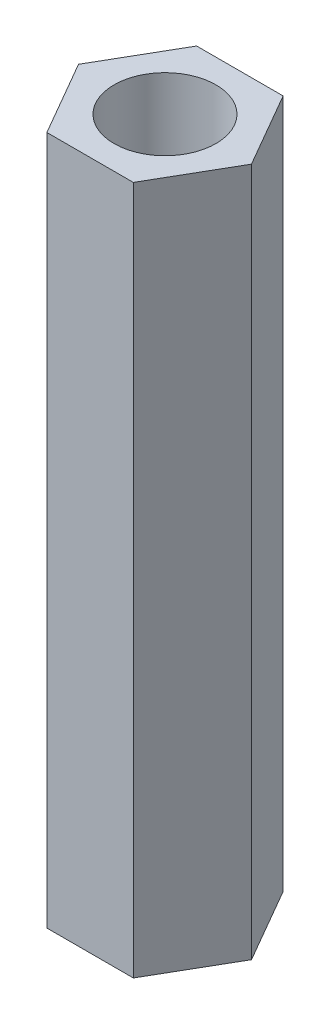
ISO-10303-21;
HEADER;
FILE_DESCRIPTION(('STEP AP214'),'2;1');
FILE_NAME('part.step','',(''),(''),'','','');
FILE_SCHEMA(('AUTOMOTIVE_DESIGN { 1 0 10303 214 1 1 1 1 }'));
ENDSEC;
DATA;
#1=APPLICATION_CONTEXT('core data for automotive mechanical design processes');
#2=APPLICATION_PROTOCOL_DEFINITION('international standard','automotive_design',2000,#1);
#3=PRODUCT_CONTEXT('',#1,'mechanical');
#4=PRODUCT('Part','Part','',(#3));
#5=PRODUCT_RELATED_PRODUCT_CATEGORY('part','',(#4));
#6=PRODUCT_DEFINITION_FORMATION('','',#4);
#7=PRODUCT_DEFINITION_CONTEXT('part definition',#1,'design');
#8=PRODUCT_DEFINITION('design','',#6,#7);
#9=PRODUCT_DEFINITION_SHAPE('','',#8);
#10=(LENGTH_UNIT() NAMED_UNIT(*) SI_UNIT(.MILLI.,.METRE.));
#11=(NAMED_UNIT(*) PLANE_ANGLE_UNIT() SI_UNIT($,.RADIAN.));
#12=(NAMED_UNIT(*) SI_UNIT($,.STERADIAN.) SOLID_ANGLE_UNIT());
#13=UNCERTAINTY_MEASURE_WITH_UNIT(LENGTH_MEASURE(1.E-05),#10,'distance_accuracy_value','');
#14=(GEOMETRIC_REPRESENTATION_CONTEXT(3) GLOBAL_UNCERTAINTY_ASSIGNED_CONTEXT((#13)) GLOBAL_UNIT_ASSIGNED_CONTEXT((#10,
#11,#12)) REPRESENTATION_CONTEXT('',''));
#15=CARTESIAN_POINT('',(0.,0.,0.));
#16=DIRECTION('',(0.,0.,1.));
#17=DIRECTION('',(1.,0.,0.));
#18=AXIS2_PLACEMENT_3D('',#15,#16,#17);
#19=CARTESIAN_POINT('',(0.,23.,0.));
#20=DIRECTION('',(0.,1.,0.));
#21=DIRECTION('',(0.,0.,1.));
#22=AXIS2_PLACEMENT_3D('',#19,#20,#21);
#23=PLANE('',#22);
#24=DIRECTION('',(0.5,0.,-0.866025403784439));
#25=VECTOR('',#24,1.);
#26=CARTESIAN_POINT('',(1.44337567297407,23.,2.5));
#27=LINE('',#26,#25);
#28=CARTESIAN_POINT('',(1.44337567297407,23.,2.5));
#29=VERTEX_POINT('',#28);
#30=CARTESIAN_POINT('',(2.88675134594813,23.,0.));
#31=VERTEX_POINT('',#30);
#32=EDGE_CURVE('E129',#29,#31,#27,.T.);
#33=ORIENTED_EDGE('',*,*,#32,.T.);
#34=DIRECTION('',(-0.5,0.,-0.866025403784438));
#35=VECTOR('',#34,1.);
#36=CARTESIAN_POINT('',(2.88675134594813,23.,0.));
#37=LINE('',#36,#35);
#38=CARTESIAN_POINT('',(1.44337567297406,23.,-2.5));
#39=VERTEX_POINT('',#38);
#40=EDGE_CURVE('E87',#31,#39,#37,.T.);
#41=ORIENTED_EDGE('',*,*,#40,.T.);
#42=DIRECTION('',(-1.,0.,0.));
#43=VECTOR('',#42,1.);
#44=CARTESIAN_POINT('',(1.44337567297406,23.,-2.5));
#45=LINE('',#44,#43);
#46=CARTESIAN_POINT('',(-1.44337567297406,23.,-2.5));
#47=VERTEX_POINT('',#46);
#48=EDGE_CURVE('E100',#39,#47,#45,.T.);
#49=ORIENTED_EDGE('',*,*,#48,.T.);
#50=DIRECTION('',(-0.5,0.,0.866025403784439));
#51=VECTOR('',#50,1.);
#52=CARTESIAN_POINT('',(-1.44337567297406,23.,-2.5));
#53=LINE('',#52,#51);
#54=CARTESIAN_POINT('',(-2.88675134594813,23.,0.));
#55=VERTEX_POINT('',#54);
#56=EDGE_CURVE('E94',#47,#55,#53,.T.);
#57=ORIENTED_EDGE('',*,*,#56,.T.);
#58=DIRECTION('',(0.5,0.,0.866025403784438));
#59=VECTOR('',#58,1.);
#60=CARTESIAN_POINT('',(-2.88675134594813,23.,0.));
#61=LINE('',#60,#59);
#62=CARTESIAN_POINT('',(-1.44337567297406,23.,2.5));
#63=VERTEX_POINT('',#62);
#64=EDGE_CURVE('E98',#55,#63,#61,.T.);
#65=ORIENTED_EDGE('',*,*,#64,.T.);
#66=DIRECTION('',(1.,0.,0.));
#67=VECTOR('',#66,1.);
#68=CARTESIAN_POINT('',(-1.44337567297406,23.,2.5));
#69=LINE('',#68,#67);
#70=EDGE_CURVE('E50',#63,#29,#69,.T.);
#71=ORIENTED_EDGE('',*,*,#70,.T.);
#72=EDGE_LOOP('',(#33,#41,#49,#57,#65,#71));
#73=FACE_BOUND('',#72,.T.);
#74=CARTESIAN_POINT('',(0.,23.,0.));
#75=DIRECTION('',(0.,1.,0.));
#76=DIRECTION('',(0.,0.,1.));
#77=AXIS2_PLACEMENT_3D('',#74,#75,#76);
#78=CIRCLE('',#77,1.7);
#79=CARTESIAN_POINT('',(0.,23.,1.7));
#80=VERTEX_POINT('',#79);
#81=EDGE_CURVE('E122',#80,#80,#78,.T.);
#82=ORIENTED_EDGE('',*,*,#81,.F.);
#83=EDGE_LOOP('',(#82));
#84=FACE_BOUND('',#83,.T.);
#85=ADVANCED_FACE('F33',(#73,#84),#23,.T.);
#86=CARTESIAN_POINT('',(0.,0.,0.));
#87=DIRECTION('',(0.,1.,0.));
#88=DIRECTION('',(0.,0.,1.));
#89=AXIS2_PLACEMENT_3D('',#86,#87,#88);
#90=PLANE('',#89);
#91=DIRECTION('',(0.5,0.,-0.866025403784439));
#92=VECTOR('',#91,1.);
#93=CARTESIAN_POINT('',(1.44337567297407,0.,2.5));
#94=LINE('',#93,#92);
#95=CARTESIAN_POINT('',(1.44337567297407,0.,2.5));
#96=VERTEX_POINT('',#95);
#97=CARTESIAN_POINT('',(2.88675134594813,0.,0.));
#98=VERTEX_POINT('',#97);
#99=EDGE_CURVE('E118',#96,#98,#94,.T.);
#100=ORIENTED_EDGE('',*,*,#99,.F.);
#101=DIRECTION('',(1.,0.,0.));
#102=VECTOR('',#101,1.);
#103=CARTESIAN_POINT('',(-1.44337567297406,0.,2.5));
#104=LINE('',#103,#102);
#105=CARTESIAN_POINT('',(-1.44337567297406,0.,2.5));
#106=VERTEX_POINT('',#105);
#107=EDGE_CURVE('E79',#106,#96,#104,.T.);
#108=ORIENTED_EDGE('',*,*,#107,.F.);
#109=DIRECTION('',(0.5,0.,0.866025403784438));
#110=VECTOR('',#109,1.);
#111=CARTESIAN_POINT('',(-2.88675134594813,0.,0.));
#112=LINE('',#111,#110);
#113=CARTESIAN_POINT('',(-2.88675134594813,0.,0.));
#114=VERTEX_POINT('',#113);
#115=EDGE_CURVE('E73',#114,#106,#112,.T.);
#116=ORIENTED_EDGE('',*,*,#115,.F.);
#117=DIRECTION('',(-0.5,0.,0.866025403784439));
#118=VECTOR('',#117,1.);
#119=CARTESIAN_POINT('',(-1.44337567297406,0.,-2.5));
#120=LINE('',#119,#118);
#121=CARTESIAN_POINT('',(-1.44337567297406,0.,-2.5));
#122=VERTEX_POINT('',#121);
#123=EDGE_CURVE('E108',#122,#114,#120,.T.);
#124=ORIENTED_EDGE('',*,*,#123,.F.);
#125=DIRECTION('',(-1.,0.,0.));
#126=VECTOR('',#125,1.);
#127=CARTESIAN_POINT('',(1.44337567297406,0.,-2.5));
#128=LINE('',#127,#126);
#129=CARTESIAN_POINT('',(1.44337567297406,0.,-2.5));
#130=VERTEX_POINT('',#129);
#131=EDGE_CURVE('E124',#130,#122,#128,.T.);
#132=ORIENTED_EDGE('',*,*,#131,.F.);
#133=DIRECTION('',(-0.5,0.,-0.866025403784438));
#134=VECTOR('',#133,1.);
#135=CARTESIAN_POINT('',(2.88675134594813,0.,0.));
#136=LINE('',#135,#134);
#137=EDGE_CURVE('E121',#98,#130,#136,.T.);
#138=ORIENTED_EDGE('',*,*,#137,.F.);
#139=EDGE_LOOP('',(#100,#108,#116,#124,#132,#138));
#140=FACE_BOUND('',#139,.T.);
#141=CARTESIAN_POINT('',(0.,0.,0.));
#142=DIRECTION('',(0.,1.,0.));
#143=DIRECTION('',(0.,0.,1.));
#144=AXIS2_PLACEMENT_3D('',#141,#142,#143);
#145=CIRCLE('',#144,1.7);
#146=CARTESIAN_POINT('',(0.,0.,1.7));
#147=VERTEX_POINT('',#146);
#148=EDGE_CURVE('E222',#147,#147,#145,.T.);
#149=ORIENTED_EDGE('',*,*,#148,.T.);
#150=EDGE_LOOP('',(#149));
#151=FACE_BOUND('',#150,.T.);
#152=ADVANCED_FACE('F138',(#140,#151),#90,.F.);
#153=CARTESIAN_POINT('',(1.44337567297407,23.,2.5));
#154=DIRECTION('',(-0.866025403784439,0.,-0.5));
#155=DIRECTION('',(-0.5,0.,0.866025403784439));
#156=AXIS2_PLACEMENT_3D('',#153,#154,#155);
#157=PLANE('',#156);
#158=ORIENTED_EDGE('',*,*,#99,.T.);
#159=DIRECTION('',(0.,-1.,0.));
#160=VECTOR('',#159,1.);
#161=CARTESIAN_POINT('',(2.88675134594813,23.,0.));
#162=LINE('',#161,#160);
#163=EDGE_CURVE('E11',#31,#98,#162,.T.);
#164=ORIENTED_EDGE('',*,*,#163,.F.);
#165=ORIENTED_EDGE('',*,*,#32,.F.);
#166=DIRECTION('',(0.,-1.,0.));
#167=VECTOR('',#166,1.);
#168=CARTESIAN_POINT('',(1.44337567297407,23.,2.5));
#169=LINE('',#168,#167);
#170=EDGE_CURVE('E114',#29,#96,#169,.T.);
#171=ORIENTED_EDGE('',*,*,#170,.T.);
#172=EDGE_LOOP('',(#158,#164,#165,#171));
#173=FACE_BOUND('',#172,.T.);
#174=ADVANCED_FACE('F35',(#173),#157,.F.);
#175=CARTESIAN_POINT('',(2.88675134594813,23.,0.));
#176=DIRECTION('',(-0.866025403784438,0.,0.5));
#177=DIRECTION('',(0.5,0.,0.866025403784439));
#178=AXIS2_PLACEMENT_3D('',#175,#176,#177);
#179=PLANE('',#178);
#180=ORIENTED_EDGE('',*,*,#137,.T.);
#181=DIRECTION('',(0.,-1.,0.));
#182=VECTOR('',#181,1.);
#183=CARTESIAN_POINT('',(1.44337567297406,23.,-2.5));
#184=LINE('',#183,#182);
#185=EDGE_CURVE('E42',#39,#130,#184,.T.);
#186=ORIENTED_EDGE('',*,*,#185,.F.);
#187=ORIENTED_EDGE('',*,*,#40,.F.);
#188=ORIENTED_EDGE('',*,*,#163,.T.);
#189=EDGE_LOOP('',(#180,#186,#187,#188));
#190=FACE_BOUND('',#189,.T.);
#191=ADVANCED_FACE('F163',(#190),#179,.F.);
#192=CARTESIAN_POINT('',(1.44337567297406,23.,-2.5));
#193=DIRECTION('',(0.,0.,1.));
#194=DIRECTION('',(1.,0.,0.));
#195=AXIS2_PLACEMENT_3D('',#192,#193,#194);
#196=PLANE('',#195);
#197=ORIENTED_EDGE('',*,*,#131,.T.);
#198=DIRECTION('',(0.,-1.,0.));
#199=VECTOR('',#198,1.);
#200=CARTESIAN_POINT('',(-1.44337567297406,23.,-2.5));
#201=LINE('',#200,#199);
#202=EDGE_CURVE('E109',#47,#122,#201,.T.);
#203=ORIENTED_EDGE('',*,*,#202,.F.);
#204=ORIENTED_EDGE('',*,*,#48,.F.);
#205=ORIENTED_EDGE('',*,*,#185,.T.);
#206=EDGE_LOOP('',(#197,#203,#204,#205));
#207=FACE_BOUND('',#206,.T.);
#208=ADVANCED_FACE('F135',(#207),#196,.F.);
#209=CARTESIAN_POINT('',(-1.44337567297406,23.,-2.5));
#210=DIRECTION('',(0.866025403784439,0.,0.5));
#211=DIRECTION('',(0.5,0.,-0.866025403784439));
#212=AXIS2_PLACEMENT_3D('',#209,#210,#211);
#213=PLANE('',#212);
#214=ORIENTED_EDGE('',*,*,#123,.T.);
#215=DIRECTION('',(0.,-1.,0.));
#216=VECTOR('',#215,1.);
#217=CARTESIAN_POINT('',(-2.88675134594813,23.,0.));
#218=LINE('',#217,#216);
#219=EDGE_CURVE('E105',#55,#114,#218,.T.);
#220=ORIENTED_EDGE('',*,*,#219,.F.);
#221=ORIENTED_EDGE('',*,*,#56,.F.);
#222=ORIENTED_EDGE('',*,*,#202,.T.);
#223=EDGE_LOOP('',(#214,#220,#221,#222));
#224=FACE_BOUND('',#223,.T.);
#225=ADVANCED_FACE('F106',(#224),#213,.F.);
#226=CARTESIAN_POINT('',(-2.88675134594813,23.,0.));
#227=DIRECTION('',(0.866025403784438,0.,-0.5));
#228=DIRECTION('',(-0.5,0.,-0.866025403784439));
#229=AXIS2_PLACEMENT_3D('',#226,#227,#228);
#230=PLANE('',#229);
#231=ORIENTED_EDGE('',*,*,#115,.T.);
#232=DIRECTION('',(0.,-1.,0.));
#233=VECTOR('',#232,1.);
#234=CARTESIAN_POINT('',(-1.44337567297406,23.,2.5));
#235=LINE('',#234,#233);
#236=EDGE_CURVE('E110',#63,#106,#235,.T.);
#237=ORIENTED_EDGE('',*,*,#236,.F.);
#238=ORIENTED_EDGE('',*,*,#64,.F.);
#239=ORIENTED_EDGE('',*,*,#219,.T.);
#240=EDGE_LOOP('',(#231,#237,#238,#239));
#241=FACE_BOUND('',#240,.T.);
#242=ADVANCED_FACE('F112',(#241),#230,.F.);
#243=CARTESIAN_POINT('',(-1.44337567297406,23.,2.5));
#244=DIRECTION('',(0.,0.,-1.));
#245=DIRECTION('',(-1.,0.,0.));
#246=AXIS2_PLACEMENT_3D('',#243,#244,#245);
#247=PLANE('',#246);
#248=ORIENTED_EDGE('',*,*,#107,.T.);
#249=ORIENTED_EDGE('',*,*,#170,.F.);
#250=ORIENTED_EDGE('',*,*,#70,.F.);
#251=ORIENTED_EDGE('',*,*,#236,.T.);
#252=EDGE_LOOP('',(#248,#249,#250,#251));
#253=FACE_BOUND('',#252,.T.);
#254=ADVANCED_FACE('F143',(#253),#247,.F.);
#255=CARTESIAN_POINT('',(0.,23.,0.));
#256=DIRECTION('',(0.,-1.,0.));
#257=DIRECTION('',(0.,0.,-1.));
#258=AXIS2_PLACEMENT_3D('',#255,#256,#257);
#259=CYLINDRICAL_SURFACE('',#258,1.7);
#260=ORIENTED_EDGE('',*,*,#81,.T.);
#261=EDGE_LOOP('',(#260));
#262=FACE_BOUND('',#261,.T.);
#263=ORIENTED_EDGE('',*,*,#148,.F.);
#264=EDGE_LOOP('',(#263));
#265=FACE_BOUND('',#264,.T.);
#266=ADVANCED_FACE('F145',(#262,#265),#259,.F.);
#267=CLOSED_SHELL('',(#85,#152,#174,#191,#208,#225,#242,#254,#266));
#268=MANIFOLD_SOLID_BREP('B2',#267);
#269=ADVANCED_BREP_SHAPE_REPRESENTATION('',(#18,#268),#14);
#270=SHAPE_DEFINITION_REPRESENTATION(#9,#269);
ENDSEC;
END-ISO-10303-21;
